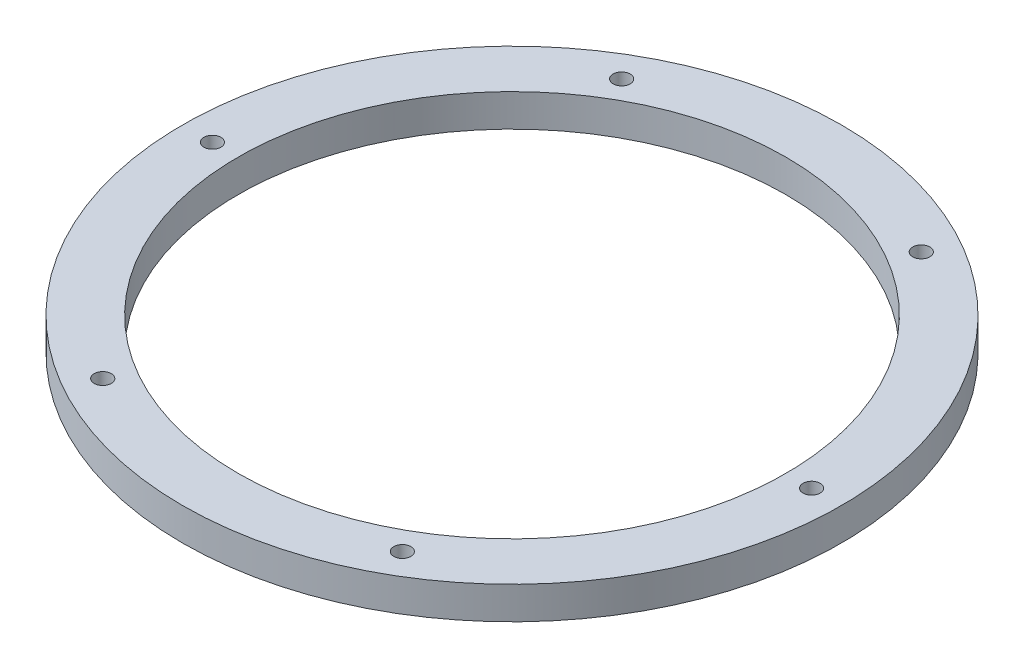
ISO-10303-21;
HEADER;
FILE_DESCRIPTION(('STEP AP214'),'2;1');
FILE_NAME('part.step','',(''),(''),'','','');
FILE_SCHEMA(('AUTOMOTIVE_DESIGN { 1 0 10303 214 1 1 1 1 }'));
ENDSEC;
DATA;
#1=APPLICATION_CONTEXT('core data for automotive mechanical design processes');
#2=APPLICATION_PROTOCOL_DEFINITION('international standard','automotive_design',2000,#1);
#3=PRODUCT_CONTEXT('',#1,'mechanical');
#4=PRODUCT('Part','Part','',(#3));
#5=PRODUCT_RELATED_PRODUCT_CATEGORY('part','',(#4));
#6=PRODUCT_DEFINITION_FORMATION('','',#4);
#7=PRODUCT_DEFINITION_CONTEXT('part definition',#1,'design');
#8=PRODUCT_DEFINITION('design','',#6,#7);
#9=PRODUCT_DEFINITION_SHAPE('','',#8);
#10=(LENGTH_UNIT() NAMED_UNIT(*) SI_UNIT(.MILLI.,.METRE.));
#11=(NAMED_UNIT(*) PLANE_ANGLE_UNIT() SI_UNIT($,.RADIAN.));
#12=(NAMED_UNIT(*) SI_UNIT($,.STERADIAN.) SOLID_ANGLE_UNIT());
#13=UNCERTAINTY_MEASURE_WITH_UNIT(LENGTH_MEASURE(1.E-05),#10,'distance_accuracy_value','');
#14=(GEOMETRIC_REPRESENTATION_CONTEXT(3) GLOBAL_UNCERTAINTY_ASSIGNED_CONTEXT((#13)) GLOBAL_UNIT_ASSIGNED_CONTEXT((#10,
#11,#12)) REPRESENTATION_CONTEXT('',''));
#15=CARTESIAN_POINT('',(0.,0.,0.));
#16=DIRECTION('',(0.,0.,1.));
#17=DIRECTION('',(1.,0.,0.));
#18=AXIS2_PLACEMENT_3D('',#15,#16,#17);
#19=CARTESIAN_POINT('',(0.,9.5,0.));
#20=DIRECTION('',(0.,1.,0.));
#21=DIRECTION('',(0.,0.,1.));
#22=AXIS2_PLACEMENT_3D('',#19,#20,#21);
#23=PLANE('',#22);
#24=CARTESIAN_POINT('',(87.4999999999934,9.5,151.554445662274));
#25=DIRECTION('',(0.,1.,0.));
#26=DIRECTION('',(0.,0.,-1.));
#27=AXIS2_PLACEMENT_3D('',#24,#25,#26);
#28=CIRCLE('',#27,5.00000000000001);
#29=CARTESIAN_POINT('',(87.4999999999934,9.5,146.554445662274));
#30=VERTEX_POINT('',#29);
#31=EDGE_CURVE('E91',#30,#30,#28,.T.);
#32=ORIENTED_EDGE('',*,*,#31,.F.);
#33=EDGE_LOOP('',(#32));
#34=FACE_BOUND('',#33,.T.);
#35=CARTESIAN_POINT('',(87.4999999999966,9.5,-151.554445662272));
#36=DIRECTION('',(0.,1.,0.));
#37=DIRECTION('',(0.,0.,1.));
#38=AXIS2_PLACEMENT_3D('',#35,#36,#37);
#39=CIRCLE('',#38,4.99999999999747);
#40=CARTESIAN_POINT('',(87.4999999999966,9.5,-146.554445662274));
#41=VERTEX_POINT('',#40);
#42=EDGE_CURVE('E75',#41,#41,#39,.T.);
#43=ORIENTED_EDGE('',*,*,#42,.F.);
#44=EDGE_LOOP('',(#43));
#45=FACE_BOUND('',#44,.T.);
#46=CARTESIAN_POINT('',(-175.,9.5,0.));
#47=DIRECTION('',(0.,1.,0.));
#48=DIRECTION('',(0.,0.,1.));
#49=AXIS2_PLACEMENT_3D('',#46,#47,#48);
#50=CIRCLE('',#49,4.99999999999999);
#51=CARTESIAN_POINT('',(-175.,9.5,4.99999999999999));
#52=VERTEX_POINT('',#51);
#53=EDGE_CURVE('E59',#52,#52,#50,.T.);
#54=ORIENTED_EDGE('',*,*,#53,.F.);
#55=EDGE_LOOP('',(#54));
#56=FACE_BOUND('',#55,.T.);
#57=CARTESIAN_POINT('',(0.,9.5,0.));
#58=DIRECTION('',(0.,1.,0.));
#59=DIRECTION('',(0.,0.,1.));
#60=AXIS2_PLACEMENT_3D('',#57,#58,#59);
#61=CIRCLE('',#60,192.5);
#62=CARTESIAN_POINT('',(0.,9.5,192.5));
#63=VERTEX_POINT('',#62);
#64=EDGE_CURVE('E10',#63,#63,#61,.T.);
#65=ORIENTED_EDGE('',*,*,#64,.T.);
#66=EDGE_LOOP('',(#65));
#67=FACE_BOUND('',#66,.T.);
#68=CARTESIAN_POINT('',(0.,9.5,0.));
#69=DIRECTION('',(0.,1.,0.));
#70=DIRECTION('',(0.,0.,1.));
#71=AXIS2_PLACEMENT_3D('',#68,#69,#70);
#72=CIRCLE('',#71,160.);
#73=CARTESIAN_POINT('',(0.,9.5,160.));
#74=VERTEX_POINT('',#73);
#75=EDGE_CURVE('E53',#74,#74,#72,.T.);
#76=ORIENTED_EDGE('',*,*,#75,.F.);
#77=EDGE_LOOP('',(#76));
#78=FACE_BOUND('',#77,.T.);
#79=CARTESIAN_POINT('',(-87.4999999999997,9.5,-151.554445662277));
#80=DIRECTION('',(0.,1.,0.));
#81=DIRECTION('',(0.,0.,1.));
#82=AXIS2_PLACEMENT_3D('',#79,#80,#81);
#83=CIRCLE('',#82,4.99999999999968);
#84=CARTESIAN_POINT('',(-87.4999999999997,9.5,-146.554445662277));
#85=VERTEX_POINT('',#84);
#86=EDGE_CURVE('E67',#85,#85,#83,.T.);
#87=ORIENTED_EDGE('',*,*,#86,.F.);
#88=EDGE_LOOP('',(#87));
#89=FACE_BOUND('',#88,.T.);
#90=CARTESIAN_POINT('',(175.,9.5,0.));
#91=DIRECTION('',(0.,1.,0.));
#92=DIRECTION('',(0.,0.,1.));
#93=AXIS2_PLACEMENT_3D('',#90,#91,#92);
#94=CIRCLE('',#93,4.99999999999999);
#95=CARTESIAN_POINT('',(175.,9.5,4.99999999999999));
#96=VERTEX_POINT('',#95);
#97=EDGE_CURVE('E83',#96,#96,#94,.T.);
#98=ORIENTED_EDGE('',*,*,#97,.F.);
#99=EDGE_LOOP('',(#98));
#100=FACE_BOUND('',#99,.T.);
#101=CARTESIAN_POINT('',(-87.5,9.5,151.554445662277));
#102=DIRECTION('',(0.,1.,0.));
#103=DIRECTION('',(0.,0.,-1.));
#104=AXIS2_PLACEMENT_3D('',#101,#102,#103);
#105=CIRCLE('',#104,5.00000000000001);
#106=CARTESIAN_POINT('',(-87.5,9.5,146.554445662277));
#107=VERTEX_POINT('',#106);
#108=EDGE_CURVE('E99',#107,#107,#105,.T.);
#109=ORIENTED_EDGE('',*,*,#108,.F.);
#110=EDGE_LOOP('',(#109));
#111=FACE_BOUND('',#110,.T.);
#112=ADVANCED_FACE('F39',(#34,#45,#56,#67,#78,#89,#100,#111),#23,.T.);
#113=CARTESIAN_POINT('',(0.,-9.5,0.));
#114=DIRECTION('',(0.,1.,0.));
#115=DIRECTION('',(0.,0.,1.));
#116=AXIS2_PLACEMENT_3D('',#113,#114,#115);
#117=PLANE('',#116);
#118=CARTESIAN_POINT('',(0.,-9.5,0.));
#119=DIRECTION('',(0.,1.,0.));
#120=DIRECTION('',(0.,0.,1.));
#121=AXIS2_PLACEMENT_3D('',#118,#119,#120);
#122=CIRCLE('',#121,192.5);
#123=CARTESIAN_POINT('',(0.,-9.5,192.5));
#124=VERTEX_POINT('',#123);
#125=EDGE_CURVE('E43',#124,#124,#122,.T.);
#126=ORIENTED_EDGE('',*,*,#125,.F.);
#127=EDGE_LOOP('',(#126));
#128=FACE_BOUND('',#127,.T.);
#129=CARTESIAN_POINT('',(0.,-9.5,0.));
#130=DIRECTION('',(0.,1.,0.));
#131=DIRECTION('',(0.,0.,1.));
#132=AXIS2_PLACEMENT_3D('',#129,#130,#131);
#133=CIRCLE('',#132,160.);
#134=CARTESIAN_POINT('',(0.,-9.5,160.));
#135=VERTEX_POINT('',#134);
#136=EDGE_CURVE('E55',#135,#135,#133,.T.);
#137=ORIENTED_EDGE('',*,*,#136,.T.);
#138=EDGE_LOOP('',(#137));
#139=FACE_BOUND('',#138,.T.);
#140=CARTESIAN_POINT('',(-175.,-9.5,0.));
#141=DIRECTION('',(0.,1.,0.));
#142=DIRECTION('',(0.,0.,1.));
#143=AXIS2_PLACEMENT_3D('',#140,#141,#142);
#144=CIRCLE('',#143,4.99999999999999);
#145=CARTESIAN_POINT('',(-175.,-9.5,4.99999999999999));
#146=VERTEX_POINT('',#145);
#147=EDGE_CURVE('E63',#146,#146,#144,.T.);
#148=ORIENTED_EDGE('',*,*,#147,.T.);
#149=EDGE_LOOP('',(#148));
#150=FACE_BOUND('',#149,.T.);
#151=CARTESIAN_POINT('',(-87.4999999999997,-9.5,-151.554445662277));
#152=DIRECTION('',(0.,1.,0.));
#153=DIRECTION('',(0.,0.,1.));
#154=AXIS2_PLACEMENT_3D('',#151,#152,#153);
#155=CIRCLE('',#154,4.99999999999968);
#156=CARTESIAN_POINT('',(-87.4999999999997,-9.5,-146.554445662277));
#157=VERTEX_POINT('',#156);
#158=EDGE_CURVE('E71',#157,#157,#155,.T.);
#159=ORIENTED_EDGE('',*,*,#158,.T.);
#160=EDGE_LOOP('',(#159));
#161=FACE_BOUND('',#160,.T.);
#162=CARTESIAN_POINT('',(87.4999999999966,-9.5,-151.554445662272));
#163=DIRECTION('',(0.,1.,0.));
#164=DIRECTION('',(0.,0.,1.));
#165=AXIS2_PLACEMENT_3D('',#162,#163,#164);
#166=CIRCLE('',#165,4.99999999999747);
#167=CARTESIAN_POINT('',(87.4999999999966,-9.5,-146.554445662274));
#168=VERTEX_POINT('',#167);
#169=EDGE_CURVE('E79',#168,#168,#166,.T.);
#170=ORIENTED_EDGE('',*,*,#169,.T.);
#171=EDGE_LOOP('',(#170));
#172=FACE_BOUND('',#171,.T.);
#173=CARTESIAN_POINT('',(175.,-9.5,0.));
#174=DIRECTION('',(0.,1.,0.));
#175=DIRECTION('',(0.,0.,1.));
#176=AXIS2_PLACEMENT_3D('',#173,#174,#175);
#177=CIRCLE('',#176,4.99999999999999);
#178=CARTESIAN_POINT('',(175.,-9.5,4.99999999999999));
#179=VERTEX_POINT('',#178);
#180=EDGE_CURVE('E87',#179,#179,#177,.T.);
#181=ORIENTED_EDGE('',*,*,#180,.T.);
#182=EDGE_LOOP('',(#181));
#183=FACE_BOUND('',#182,.T.);
#184=CARTESIAN_POINT('',(87.4999999999934,-9.5,151.554445662274));
#185=DIRECTION('',(0.,1.,0.));
#186=DIRECTION('',(0.,0.,-1.));
#187=AXIS2_PLACEMENT_3D('',#184,#185,#186);
#188=CIRCLE('',#187,5.00000000000001);
#189=CARTESIAN_POINT('',(87.4999999999934,-9.5,146.554445662274));
#190=VERTEX_POINT('',#189);
#191=EDGE_CURVE('E95',#190,#190,#188,.T.);
#192=ORIENTED_EDGE('',*,*,#191,.T.);
#193=EDGE_LOOP('',(#192));
#194=FACE_BOUND('',#193,.T.);
#195=CARTESIAN_POINT('',(-87.5,-9.5,151.554445662277));
#196=DIRECTION('',(0.,1.,0.));
#197=DIRECTION('',(0.,0.,-1.));
#198=AXIS2_PLACEMENT_3D('',#195,#196,#197);
#199=CIRCLE('',#198,5.00000000000001);
#200=CARTESIAN_POINT('',(-87.5,-9.5,146.554445662277));
#201=VERTEX_POINT('',#200);
#202=EDGE_CURVE('E103',#201,#201,#199,.T.);
#203=ORIENTED_EDGE('',*,*,#202,.T.);
#204=EDGE_LOOP('',(#203));
#205=FACE_BOUND('',#204,.T.);
#206=ADVANCED_FACE('F116',(#128,#139,#150,#161,#172,#183,#194,#205),#117,.F.);
#207=CARTESIAN_POINT('',(0.,9.5,0.));
#208=DIRECTION('',(0.,-1.,0.));
#209=DIRECTION('',(0.,0.,-1.));
#210=AXIS2_PLACEMENT_3D('',#207,#208,#209);
#211=CYLINDRICAL_SURFACE('',#210,192.5);
#212=ORIENTED_EDGE('',*,*,#64,.F.);
#213=EDGE_LOOP('',(#212));
#214=FACE_BOUND('',#213,.T.);
#215=ORIENTED_EDGE('',*,*,#125,.T.);
#216=EDGE_LOOP('',(#215));
#217=FACE_BOUND('',#216,.T.);
#218=ADVANCED_FACE('F41',(#214,#217),#211,.T.);
#219=CARTESIAN_POINT('',(0.,9.5,0.));
#220=DIRECTION('',(0.,-1.,0.));
#221=DIRECTION('',(0.,0.,-1.));
#222=AXIS2_PLACEMENT_3D('',#219,#220,#221);
#223=CYLINDRICAL_SURFACE('',#222,160.);
#224=ORIENTED_EDGE('',*,*,#75,.T.);
#225=EDGE_LOOP('',(#224));
#226=FACE_BOUND('',#225,.T.);
#227=ORIENTED_EDGE('',*,*,#136,.F.);
#228=EDGE_LOOP('',(#227));
#229=FACE_BOUND('',#228,.T.);
#230=ADVANCED_FACE('F126',(#226,#229),#223,.F.);
#231=CARTESIAN_POINT('',(-175.,9.5,0.));
#232=DIRECTION('',(0.,-1.,0.));
#233=DIRECTION('',(0.,0.,-1.));
#234=AXIS2_PLACEMENT_3D('',#231,#232,#233);
#235=CYLINDRICAL_SURFACE('',#234,4.99999999999999);
#236=ORIENTED_EDGE('',*,*,#53,.T.);
#237=EDGE_LOOP('',(#236));
#238=FACE_BOUND('',#237,.T.);
#239=ORIENTED_EDGE('',*,*,#147,.F.);
#240=EDGE_LOOP('',(#239));
#241=FACE_BOUND('',#240,.T.);
#242=ADVANCED_FACE('F129',(#238,#241),#235,.F.);
#243=CARTESIAN_POINT('',(-87.4999999999997,9.5,-151.554445662277));
#244=DIRECTION('',(0.,-1.,0.));
#245=DIRECTION('',(0.,0.,-1.));
#246=AXIS2_PLACEMENT_3D('',#243,#244,#245);
#247=CYLINDRICAL_SURFACE('',#246,4.99999999999968);
#248=ORIENTED_EDGE('',*,*,#86,.T.);
#249=EDGE_LOOP('',(#248));
#250=FACE_BOUND('',#249,.T.);
#251=ORIENTED_EDGE('',*,*,#158,.F.);
#252=EDGE_LOOP('',(#251));
#253=FACE_BOUND('',#252,.T.);
#254=ADVANCED_FACE('F133',(#250,#253),#247,.F.);
#255=CARTESIAN_POINT('',(87.4999999999966,9.5,-151.554445662272));
#256=DIRECTION('',(0.,-1.,0.));
#257=DIRECTION('',(0.,0.,-1.));
#258=AXIS2_PLACEMENT_3D('',#255,#256,#257);
#259=CYLINDRICAL_SURFACE('',#258,4.99999999999747);
#260=ORIENTED_EDGE('',*,*,#42,.T.);
#261=EDGE_LOOP('',(#260));
#262=FACE_BOUND('',#261,.T.);
#263=ORIENTED_EDGE('',*,*,#169,.F.);
#264=EDGE_LOOP('',(#263));
#265=FACE_BOUND('',#264,.T.);
#266=ADVANCED_FACE('F137',(#262,#265),#259,.F.);
#267=CARTESIAN_POINT('',(175.,9.5,0.));
#268=DIRECTION('',(0.,-1.,0.));
#269=DIRECTION('',(0.,0.,-1.));
#270=AXIS2_PLACEMENT_3D('',#267,#268,#269);
#271=CYLINDRICAL_SURFACE('',#270,4.99999999999999);
#272=ORIENTED_EDGE('',*,*,#97,.T.);
#273=EDGE_LOOP('',(#272));
#274=FACE_BOUND('',#273,.T.);
#275=ORIENTED_EDGE('',*,*,#180,.F.);
#276=EDGE_LOOP('',(#275));
#277=FACE_BOUND('',#276,.T.);
#278=ADVANCED_FACE('F141',(#274,#277),#271,.F.);
#279=CARTESIAN_POINT('',(87.4999999999934,9.5,151.554445662274));
#280=DIRECTION('',(0.,-1.,0.));
#281=DIRECTION('',(0.,0.,-1.));
#282=AXIS2_PLACEMENT_3D('',#279,#280,#281);
#283=CYLINDRICAL_SURFACE('',#282,5.00000000000001);
#284=ORIENTED_EDGE('',*,*,#31,.T.);
#285=EDGE_LOOP('',(#284));
#286=FACE_BOUND('',#285,.T.);
#287=ORIENTED_EDGE('',*,*,#191,.F.);
#288=EDGE_LOOP('',(#287));
#289=FACE_BOUND('',#288,.T.);
#290=ADVANCED_FACE('F145',(#286,#289),#283,.F.);
#291=CARTESIAN_POINT('',(-87.5,9.5,151.554445662277));
#292=DIRECTION('',(0.,-1.,0.));
#293=DIRECTION('',(0.,0.,-1.));
#294=AXIS2_PLACEMENT_3D('',#291,#292,#293);
#295=CYLINDRICAL_SURFACE('',#294,5.00000000000001);
#296=ORIENTED_EDGE('',*,*,#108,.T.);
#297=EDGE_LOOP('',(#296));
#298=FACE_BOUND('',#297,.T.);
#299=ORIENTED_EDGE('',*,*,#202,.F.);
#300=EDGE_LOOP('',(#299));
#301=FACE_BOUND('',#300,.T.);
#302=ADVANCED_FACE('F112',(#298,#301),#295,.F.);
#303=CLOSED_SHELL('',(#112,#206,#218,#230,#242,#254,#266,#278,#290,#302));
#304=MANIFOLD_SOLID_BREP('B2',#303);
#305=ADVANCED_BREP_SHAPE_REPRESENTATION('',(#18,#304),#14);
#306=SHAPE_DEFINITION_REPRESENTATION(#9,#305);
ENDSEC;
END-ISO-10303-21;
